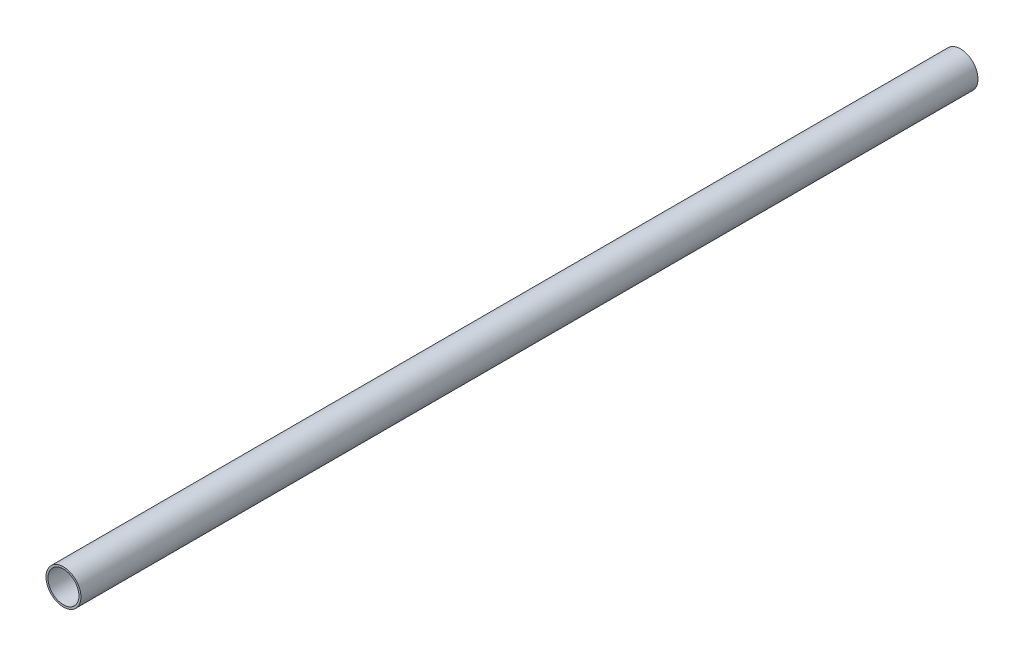
ISO-10303-21;
HEADER;
FILE_DESCRIPTION(('STEP AP214'),'2;1');
FILE_NAME('part.step','',(''),(''),'','','');
FILE_SCHEMA(('AUTOMOTIVE_DESIGN { 1 0 10303 214 1 1 1 1 }'));
ENDSEC;
DATA;
#1=APPLICATION_CONTEXT('core data for automotive mechanical design processes');
#2=APPLICATION_PROTOCOL_DEFINITION('international standard','automotive_design',2000,#1);
#3=PRODUCT_CONTEXT('',#1,'mechanical');
#4=PRODUCT('Part','Part','',(#3));
#5=PRODUCT_RELATED_PRODUCT_CATEGORY('part','',(#4));
#6=PRODUCT_DEFINITION_FORMATION('','',#4);
#7=PRODUCT_DEFINITION_CONTEXT('part definition',#1,'design');
#8=PRODUCT_DEFINITION('design','',#6,#7);
#9=PRODUCT_DEFINITION_SHAPE('','',#8);
#10=(LENGTH_UNIT() NAMED_UNIT(*) SI_UNIT(.MILLI.,.METRE.));
#11=(NAMED_UNIT(*) PLANE_ANGLE_UNIT() SI_UNIT($,.RADIAN.));
#12=(NAMED_UNIT(*) SI_UNIT($,.STERADIAN.) SOLID_ANGLE_UNIT());
#13=UNCERTAINTY_MEASURE_WITH_UNIT(LENGTH_MEASURE(1.E-05),#10,'distance_accuracy_value','');
#14=(GEOMETRIC_REPRESENTATION_CONTEXT(3) GLOBAL_UNCERTAINTY_ASSIGNED_CONTEXT((#13)) GLOBAL_UNIT_ASSIGNED_CONTEXT((#10,
#11,#12)) REPRESENTATION_CONTEXT('',''));
#15=CARTESIAN_POINT('',(0.,0.,0.));
#16=DIRECTION('',(0.,0.,1.));
#17=DIRECTION('',(1.,0.,0.));
#18=AXIS2_PLACEMENT_3D('',#15,#16,#17);
#19=CARTESIAN_POINT('',(0.,0.,488.95));
#20=DIRECTION('',(0.,0.,-1.));
#21=DIRECTION('',(0.,-1.,0.));
#22=AXIS2_PLACEMENT_3D('',#19,#20,#21);
#23=CYLINDRICAL_SURFACE('',#22,16.891);
#24=CARTESIAN_POINT('',(0.,0.,488.95));
#25=DIRECTION('',(0.,0.,1.));
#26=DIRECTION('',(1.,0.,0.));
#27=AXIS2_PLACEMENT_3D('',#24,#25,#26);
#28=CIRCLE('',#27,16.891);
#29=CARTESIAN_POINT('',(16.891,0.,488.95));
#30=VERTEX_POINT('',#29);
#31=EDGE_CURVE('E9',#30,#30,#28,.T.);
#32=ORIENTED_EDGE('',*,*,#31,.T.);
#33=EDGE_LOOP('',(#32));
#34=FACE_BOUND('',#33,.T.);
#35=CARTESIAN_POINT('',(0.,0.,-488.95));
#36=DIRECTION('',(0.,0.,1.));
#37=DIRECTION('',(1.,0.,0.));
#38=AXIS2_PLACEMENT_3D('',#35,#36,#37);
#39=CIRCLE('',#38,16.891);
#40=CARTESIAN_POINT('',(16.891,0.,-488.95));
#41=VERTEX_POINT('',#40);
#42=EDGE_CURVE('E28',#41,#41,#39,.T.);
#43=ORIENTED_EDGE('',*,*,#42,.F.);
#44=EDGE_LOOP('',(#43));
#45=FACE_BOUND('',#44,.T.);
#46=ADVANCED_FACE('F14',(#34,#45),#23,.F.);
#47=CARTESIAN_POINT('',(0.,0.,488.95));
#48=DIRECTION('',(0.,0.,-1.));
#49=DIRECTION('',(0.,-1.,0.));
#50=AXIS2_PLACEMENT_3D('',#47,#48,#49);
#51=CYLINDRICAL_SURFACE('',#50,19.05);
#52=CARTESIAN_POINT('',(0.,0.,488.95));
#53=DIRECTION('',(0.,0.,1.));
#54=DIRECTION('',(1.,0.,0.));
#55=AXIS2_PLACEMENT_3D('',#52,#53,#54);
#56=CIRCLE('',#55,19.05);
#57=CARTESIAN_POINT('',(19.05,0.,488.95));
#58=VERTEX_POINT('',#57);
#59=EDGE_CURVE('E26',#58,#58,#56,.T.);
#60=ORIENTED_EDGE('',*,*,#59,.F.);
#61=EDGE_LOOP('',(#60));
#62=FACE_BOUND('',#61,.T.);
#63=CARTESIAN_POINT('',(0.,0.,-488.95));
#64=DIRECTION('',(0.,0.,1.));
#65=DIRECTION('',(1.,0.,0.));
#66=AXIS2_PLACEMENT_3D('',#63,#64,#65);
#67=CIRCLE('',#66,19.05);
#68=CARTESIAN_POINT('',(19.05,0.,-488.95));
#69=VERTEX_POINT('',#68);
#70=EDGE_CURVE('E18',#69,#69,#67,.T.);
#71=ORIENTED_EDGE('',*,*,#70,.T.);
#72=EDGE_LOOP('',(#71));
#73=FACE_BOUND('',#72,.T.);
#74=ADVANCED_FACE('F16',(#62,#73),#51,.T.);
#75=CARTESIAN_POINT('',(0.,0.,488.95));
#76=DIRECTION('',(0.,0.,1.));
#77=DIRECTION('',(1.,0.,0.));
#78=AXIS2_PLACEMENT_3D('',#75,#76,#77);
#79=PLANE('',#78);
#80=ORIENTED_EDGE('',*,*,#59,.T.);
#81=EDGE_LOOP('',(#80));
#82=FACE_BOUND('',#81,.T.);
#83=ORIENTED_EDGE('',*,*,#31,.F.);
#84=EDGE_LOOP('',(#83));
#85=FACE_BOUND('',#84,.T.);
#86=ADVANCED_FACE('F33',(#82,#85),#79,.T.);
#87=CARTESIAN_POINT('',(0.,0.,-488.95));
#88=DIRECTION('',(0.,0.,1.));
#89=DIRECTION('',(1.,0.,0.));
#90=AXIS2_PLACEMENT_3D('',#87,#88,#89);
#91=PLANE('',#90);
#92=ORIENTED_EDGE('',*,*,#70,.F.);
#93=EDGE_LOOP('',(#92));
#94=FACE_BOUND('',#93,.T.);
#95=ORIENTED_EDGE('',*,*,#42,.T.);
#96=EDGE_LOOP('',(#95));
#97=FACE_BOUND('',#96,.T.);
#98=ADVANCED_FACE('F40',(#94,#97),#91,.F.);
#99=CLOSED_SHELL('',(#46,#74,#86,#98));
#100=MANIFOLD_SOLID_BREP('B1',#99);
#101=ADVANCED_BREP_SHAPE_REPRESENTATION('',(#18,#100),#14);
#102=SHAPE_DEFINITION_REPRESENTATION(#9,#101);
ENDSEC;
END-ISO-10303-21;
